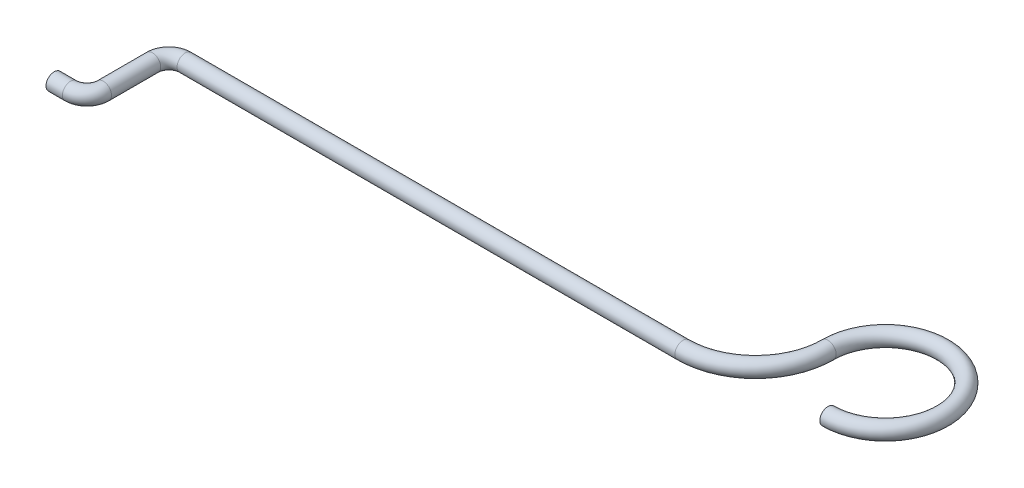
ISO-10303-21;
HEADER;
FILE_DESCRIPTION(('STEP AP214'),'2;1');
FILE_NAME('part.step','',(''),(''),'','','');
FILE_SCHEMA(('AUTOMOTIVE_DESIGN { 1 0 10303 214 1 1 1 1 }'));
ENDSEC;
DATA;
#1=APPLICATION_CONTEXT('core data for automotive mechanical design processes');
#2=APPLICATION_PROTOCOL_DEFINITION('international standard','automotive_design',2000,#1);
#3=PRODUCT_CONTEXT('',#1,'mechanical');
#4=PRODUCT('Part','Part','',(#3));
#5=PRODUCT_RELATED_PRODUCT_CATEGORY('part','',(#4));
#6=PRODUCT_DEFINITION_FORMATION('','',#4);
#7=PRODUCT_DEFINITION_CONTEXT('part definition',#1,'design');
#8=PRODUCT_DEFINITION('design','',#6,#7);
#9=PRODUCT_DEFINITION_SHAPE('','',#8);
#10=(LENGTH_UNIT() NAMED_UNIT(*) SI_UNIT(.MILLI.,.METRE.));
#11=(NAMED_UNIT(*) PLANE_ANGLE_UNIT() SI_UNIT($,.RADIAN.));
#12=(NAMED_UNIT(*) SI_UNIT($,.STERADIAN.) SOLID_ANGLE_UNIT());
#13=UNCERTAINTY_MEASURE_WITH_UNIT(LENGTH_MEASURE(1.E-05),#10,'distance_accuracy_value','');
#14=(GEOMETRIC_REPRESENTATION_CONTEXT(3) GLOBAL_UNCERTAINTY_ASSIGNED_CONTEXT((#13)) GLOBAL_UNIT_ASSIGNED_CONTEXT((#10,
#11,#12)) REPRESENTATION_CONTEXT('',''));
#15=CARTESIAN_POINT('',(0.,0.,0.));
#16=DIRECTION('',(0.,0.,1.));
#17=DIRECTION('',(1.,0.,0.));
#18=AXIS2_PLACEMENT_3D('',#15,#16,#17);
#19=CARTESIAN_POINT('',(41.305467411846,0.,-9.42201710220625));
#20=DIRECTION('',(0.,-1.,0.));
#21=DIRECTION('',(0.,0.,-1.));
#22=AXIS2_PLACEMENT_3D('',#19,#20,#21);
#23=TOROIDAL_SURFACE('',#22,3.5,0.5);
#24=CARTESIAN_POINT('',(37.805467411846,0.,-9.42201710220624));
#25=DIRECTION('',(0.,0.,-1.));
#26=DIRECTION('',(-1.,0.,0.));
#27=AXIS2_PLACEMENT_3D('',#24,#25,#26);
#28=CIRCLE('',#27,0.5);
#29=CARTESIAN_POINT('',(37.305467411846,0.,-9.42201710220624));
#30=VERTEX_POINT('',#29);
#31=EDGE_CURVE('E37',#30,#30,#28,.T.);
#32=CARTESIAN_POINT('',(41.305467411846,0.,-5.92201710220625));
#33=DIRECTION('',(-1.,0.,0.));
#34=DIRECTION('',(0.,0.,1.));
#35=AXIS2_PLACEMENT_3D('',#32,#33,#34);
#36=CIRCLE('',#35,0.5);
#37=CARTESIAN_POINT('',(41.305467411846,0.,-5.42201710220625));
#38=VERTEX_POINT('',#37);
#39=EDGE_CURVE('E10',#38,#38,#36,.T.);
#40=CARTESIAN_POINT('',(41.305467411846,0.,-9.42201710220625));
#41=DIRECTION('',(0.,-1.,0.));
#42=DIRECTION('',(0.,0.,-1.));
#43=AXIS2_PLACEMENT_3D('',#40,#41,#42);
#44=CIRCLE('',#43,4.);
#45=EDGE_CURVE('',#30,#38,#44,.T.);
#46=ORIENTED_EDGE('',*,*,#31,.T.);
#47=ORIENTED_EDGE('',*,*,#39,.F.);
#48=ORIENTED_EDGE('',*,*,#45,.T.);
#49=ORIENTED_EDGE('',*,*,#45,.F.);
#50=EDGE_LOOP('',(#46,#48,#47,#49));
#51=FACE_BOUND('',#50,.T.);
#52=ADVANCED_FACE('F31',(#51),#23,.T.);
#53=CARTESIAN_POINT('',(33.3834503096398,0.,-9.42201710220625));
#54=DIRECTION('',(0.,1.,0.));
#55=DIRECTION('',(0.,0.,1.));
#56=AXIS2_PLACEMENT_3D('',#53,#54,#55);
#57=TOROIDAL_SURFACE('',#56,4.42201710220624,0.5);
#58=CARTESIAN_POINT('',(33.3834503096398,0.,-5.));
#59=DIRECTION('',(1.,0.,0.));
#60=DIRECTION('',(0.,0.,-1.));
#61=AXIS2_PLACEMENT_3D('',#58,#59,#60);
#62=CIRCLE('',#61,0.5);
#63=CARTESIAN_POINT('',(33.3834503096398,0.,-5.5));
#64=VERTEX_POINT('',#63);
#65=EDGE_CURVE('E41',#64,#64,#62,.T.);
#66=ORIENTED_EDGE('',*,*,#65,.T.);
#67=EDGE_LOOP('',(#66));
#68=FACE_BOUND('',#67,.T.);
#69=ORIENTED_EDGE('',*,*,#31,.F.);
#70=EDGE_LOOP('',(#69));
#71=FACE_BOUND('',#70,.T.);
#72=ADVANCED_FACE('F81',(#68,#71),#57,.T.);
#73=CARTESIAN_POINT('',(3.,0.,-5.));
#74=DIRECTION('',(1.,0.,0.));
#75=DIRECTION('',(0.,0.,-1.));
#76=AXIS2_PLACEMENT_3D('',#73,#74,#75);
#77=CYLINDRICAL_SURFACE('',#76,0.5);
#78=CARTESIAN_POINT('',(3.,0.,-5.));
#79=DIRECTION('',(1.,0.,0.));
#80=DIRECTION('',(0.,0.,-1.));
#81=AXIS2_PLACEMENT_3D('',#78,#79,#80);
#82=CIRCLE('',#81,0.5);
#83=CARTESIAN_POINT('',(3.,0.,-5.5));
#84=VERTEX_POINT('',#83);
#85=EDGE_CURVE('E45',#84,#84,#82,.T.);
#86=ORIENTED_EDGE('',*,*,#85,.T.);
#87=EDGE_LOOP('',(#86));
#88=FACE_BOUND('',#87,.T.);
#89=ORIENTED_EDGE('',*,*,#65,.F.);
#90=EDGE_LOOP('',(#89));
#91=FACE_BOUND('',#90,.T.);
#92=ADVANCED_FACE('F85',(#88,#91),#77,.T.);
#93=CARTESIAN_POINT('',(3.,0.,-4.));
#94=DIRECTION('',(0.,-1.,0.));
#95=DIRECTION('',(0.,0.,-1.));
#96=AXIS2_PLACEMENT_3D('',#93,#94,#95);
#97=TOROIDAL_SURFACE('',#96,1.,0.5);
#98=CARTESIAN_POINT('',(2.,0.,-4.));
#99=DIRECTION('',(0.,0.,-1.));
#100=DIRECTION('',(-1.,0.,0.));
#101=AXIS2_PLACEMENT_3D('',#98,#99,#100);
#102=CIRCLE('',#101,0.5);
#103=CARTESIAN_POINT('',(1.5,0.,-4.));
#104=VERTEX_POINT('',#103);
#105=EDGE_CURVE('E50',#104,#104,#102,.T.);
#106=CARTESIAN_POINT('',(3.,0.,-4.));
#107=DIRECTION('',(0.,-1.,0.));
#108=DIRECTION('',(0.,0.,-1.));
#109=AXIS2_PLACEMENT_3D('',#106,#107,#108);
#110=CIRCLE('',#109,1.5);
#111=EDGE_CURVE('',#104,#84,#110,.T.);
#112=ORIENTED_EDGE('',*,*,#105,.T.);
#113=ORIENTED_EDGE('',*,*,#85,.F.);
#114=ORIENTED_EDGE('',*,*,#111,.T.);
#115=ORIENTED_EDGE('',*,*,#111,.F.);
#116=EDGE_LOOP('',(#112,#114,#113,#115));
#117=FACE_BOUND('',#116,.T.);
#118=ADVANCED_FACE('F91',(#117),#97,.T.);
#119=CARTESIAN_POINT('',(2.,0.,-1.));
#120=DIRECTION('',(0.,0.,-1.));
#121=DIRECTION('',(-1.,0.,0.));
#122=AXIS2_PLACEMENT_3D('',#119,#120,#121);
#123=CYLINDRICAL_SURFACE('',#122,0.5);
#124=CARTESIAN_POINT('',(2.,0.,-1.));
#125=DIRECTION('',(0.,0.,-1.));
#126=DIRECTION('',(-1.,0.,0.));
#127=AXIS2_PLACEMENT_3D('',#124,#125,#126);
#128=CIRCLE('',#127,0.5);
#129=CARTESIAN_POINT('',(2.5,0.,-1.));
#130=VERTEX_POINT('',#129);
#131=EDGE_CURVE('E53',#130,#130,#128,.T.);
#132=ORIENTED_EDGE('',*,*,#131,.T.);
#133=EDGE_LOOP('',(#132));
#134=FACE_BOUND('',#133,.T.);
#135=ORIENTED_EDGE('',*,*,#105,.F.);
#136=EDGE_LOOP('',(#135));
#137=FACE_BOUND('',#136,.T.);
#138=ADVANCED_FACE('F98',(#134,#137),#123,.T.);
#139=CARTESIAN_POINT('',(1.,0.,-1.));
#140=DIRECTION('',(0.,1.,0.));
#141=DIRECTION('',(0.,0.,1.));
#142=AXIS2_PLACEMENT_3D('',#139,#140,#141);
#143=TOROIDAL_SURFACE('',#142,1.,0.5);
#144=CARTESIAN_POINT('',(1.,0.,0.));
#145=DIRECTION('',(1.,0.,0.));
#146=DIRECTION('',(0.,0.,-1.));
#147=AXIS2_PLACEMENT_3D('',#144,#145,#146);
#148=CIRCLE('',#147,0.5);
#149=CARTESIAN_POINT('',(1.,0.,0.5));
#150=VERTEX_POINT('',#149);
#151=EDGE_CURVE('E56',#150,#150,#148,.T.);
#152=CARTESIAN_POINT('',(1.,0.,-1.));
#153=DIRECTION('',(0.,1.,0.));
#154=DIRECTION('',(0.,0.,1.));
#155=AXIS2_PLACEMENT_3D('',#152,#153,#154);
#156=CIRCLE('',#155,1.5);
#157=EDGE_CURVE('',#150,#130,#156,.T.);
#158=ORIENTED_EDGE('',*,*,#151,.T.);
#159=ORIENTED_EDGE('',*,*,#131,.F.);
#160=ORIENTED_EDGE('',*,*,#157,.T.);
#161=ORIENTED_EDGE('',*,*,#157,.F.);
#162=EDGE_LOOP('',(#158,#160,#159,#161));
#163=FACE_BOUND('',#162,.T.);
#164=ADVANCED_FACE('F63',(#163),#143,.T.);
#165=CARTESIAN_POINT('',(1.,0.,0.));
#166=DIRECTION('',(-1.,0.,0.));
#167=DIRECTION('',(0.,0.,1.));
#168=AXIS2_PLACEMENT_3D('',#165,#166,#167);
#169=CYLINDRICAL_SURFACE('',#168,0.5);
#170=ORIENTED_EDGE('',*,*,#151,.F.);
#171=EDGE_LOOP('',(#170));
#172=FACE_BOUND('',#171,.T.);
#173=CARTESIAN_POINT('',(0.,0.,0.));
#174=DIRECTION('',(1.,0.,0.));
#175=DIRECTION('',(0.,0.,-1.));
#176=AXIS2_PLACEMENT_3D('',#173,#174,#175);
#177=CIRCLE('',#176,0.5);
#178=CARTESIAN_POINT('',(0.,0.,-0.5));
#179=VERTEX_POINT('',#178);
#180=EDGE_CURVE('E57',#179,#179,#177,.T.);
#181=ORIENTED_EDGE('',*,*,#180,.T.);
#182=EDGE_LOOP('',(#181));
#183=FACE_BOUND('',#182,.T.);
#184=ADVANCED_FACE('F66',(#172,#183),#169,.T.);
#185=CARTESIAN_POINT('',(41.305467411846,0.,-5.92201710220625));
#186=DIRECTION('',(-1.,0.,0.));
#187=DIRECTION('',(0.,0.,1.));
#188=AXIS2_PLACEMENT_3D('',#185,#186,#187);
#189=PLANE('',#188);
#190=ORIENTED_EDGE('',*,*,#39,.T.);
#191=EDGE_LOOP('',(#190));
#192=FACE_BOUND('',#191,.T.);
#193=ADVANCED_FACE('F69',(#192),#189,.T.);
#194=CARTESIAN_POINT('',(0.,0.,0.));
#195=DIRECTION('',(1.,0.,0.));
#196=DIRECTION('',(0.,0.,-1.));
#197=AXIS2_PLACEMENT_3D('',#194,#195,#196);
#198=PLANE('',#197);
#199=ORIENTED_EDGE('',*,*,#180,.F.);
#200=EDGE_LOOP('',(#199));
#201=FACE_BOUND('',#200,.T.);
#202=ADVANCED_FACE('F73',(#201),#198,.F.);
#203=CLOSED_SHELL('',(#52,#72,#92,#118,#138,#164,#184,#193,#202));
#204=MANIFOLD_SOLID_BREP('B2',#203);
#205=ADVANCED_BREP_SHAPE_REPRESENTATION('',(#18,#204),#14);
#206=SHAPE_DEFINITION_REPRESENTATION(#9,#205);
ENDSEC;
END-ISO-10303-21;
